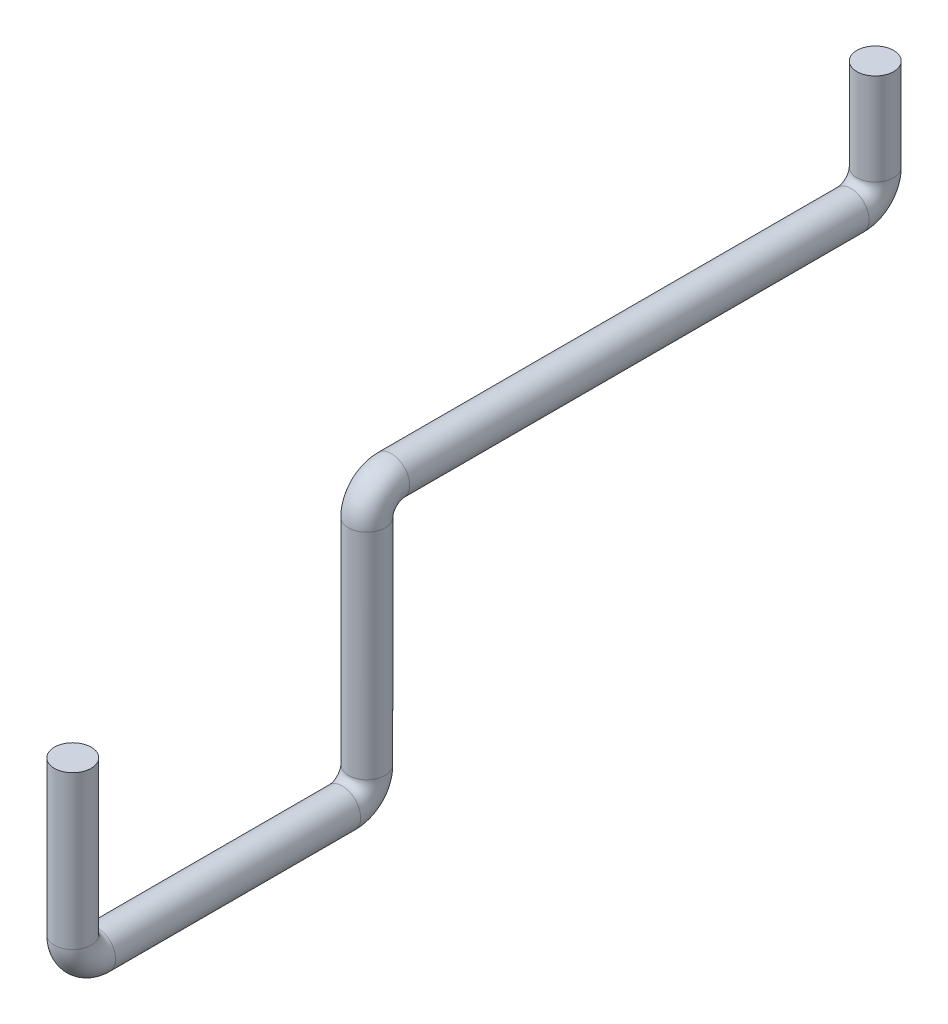
ISO-10303-21;
HEADER;
FILE_DESCRIPTION(('STEP AP214'),'2;1');
FILE_NAME('part.step','',(''),(''),'','','');
FILE_SCHEMA(('AUTOMOTIVE_DESIGN { 1 0 10303 214 1 1 1 1 }'));
ENDSEC;
DATA;
#1=APPLICATION_CONTEXT('core data for automotive mechanical design processes');
#2=APPLICATION_PROTOCOL_DEFINITION('international standard','automotive_design',2000,#1);
#3=PRODUCT_CONTEXT('',#1,'mechanical');
#4=PRODUCT('Part','Part','',(#3));
#5=PRODUCT_RELATED_PRODUCT_CATEGORY('part','',(#4));
#6=PRODUCT_DEFINITION_FORMATION('','',#4);
#7=PRODUCT_DEFINITION_CONTEXT('part definition',#1,'design');
#8=PRODUCT_DEFINITION('design','',#6,#7);
#9=PRODUCT_DEFINITION_SHAPE('','',#8);
#10=(LENGTH_UNIT() NAMED_UNIT(*) SI_UNIT(.MILLI.,.METRE.));
#11=(NAMED_UNIT(*) PLANE_ANGLE_UNIT() SI_UNIT($,.RADIAN.));
#12=(NAMED_UNIT(*) SI_UNIT($,.STERADIAN.) SOLID_ANGLE_UNIT());
#13=UNCERTAINTY_MEASURE_WITH_UNIT(LENGTH_MEASURE(1.E-05),#10,'distance_accuracy_value','');
#14=(GEOMETRIC_REPRESENTATION_CONTEXT(3) GLOBAL_UNCERTAINTY_ASSIGNED_CONTEXT((#13)) GLOBAL_UNIT_ASSIGNED_CONTEXT((#10,
#11,#12)) REPRESENTATION_CONTEXT('',''));
#15=CARTESIAN_POINT('',(0.,0.,0.));
#16=DIRECTION('',(0.,0.,1.));
#17=DIRECTION('',(1.,0.,0.));
#18=AXIS2_PLACEMENT_3D('',#15,#16,#17);
#19=CARTESIAN_POINT('',(0.,0.,0.));
#20=DIRECTION('',(0.,1.,0.));
#21=DIRECTION('',(0.,0.,1.));
#22=AXIS2_PLACEMENT_3D('',#19,#20,#21);
#23=PLANE('',#22);
#24=CARTESIAN_POINT('',(0.,0.,0.));
#25=DIRECTION('',(0.,1.,0.));
#26=DIRECTION('',(0.,0.,1.));
#27=AXIS2_PLACEMENT_3D('',#24,#25,#26);
#28=CIRCLE('',#27,0.6);
#29=CARTESIAN_POINT('',(0.,0.,0.6));
#30=VERTEX_POINT('',#29);
#31=EDGE_CURVE('E69',#30,#30,#28,.T.);
#32=ORIENTED_EDGE('',*,*,#31,.T.);
#33=EDGE_LOOP('',(#32));
#34=FACE_BOUND('',#33,.T.);
#35=ADVANCED_FACE('F57',(#34),#23,.T.);
#36=CARTESIAN_POINT('',(0.,6.6,-26.2));
#37=DIRECTION('',(0.,-1.,0.));
#38=DIRECTION('',(0.,0.,-1.));
#39=AXIS2_PLACEMENT_3D('',#36,#37,#38);
#40=PLANE('',#39);
#41=CARTESIAN_POINT('',(0.,6.6,-26.2));
#42=DIRECTION('',(0.,-1.,0.));
#43=DIRECTION('',(0.,0.,-1.));
#44=AXIS2_PLACEMENT_3D('',#41,#42,#43);
#45=CIRCLE('',#44,0.6);
#46=CARTESIAN_POINT('',(0.,6.6,-26.8));
#47=VERTEX_POINT('',#46);
#48=EDGE_CURVE('E14',#47,#47,#45,.T.);
#49=ORIENTED_EDGE('',*,*,#48,.F.);
#50=EDGE_LOOP('',(#49));
#51=FACE_BOUND('',#50,.T.);
#52=ADVANCED_FACE('F75',(#51),#40,.F.);
#53=CARTESIAN_POINT('',(0.,0.,0.));
#54=DIRECTION('',(0.,-1.,0.));
#55=DIRECTION('',(0.,0.,-1.));
#56=AXIS2_PLACEMENT_3D('',#53,#54,#55);
#57=CYLINDRICAL_SURFACE('',#56,0.6);
#58=CARTESIAN_POINT('',(0.,-5.,0.));
#59=DIRECTION('',(0.,1.,0.));
#60=DIRECTION('',(0.,0.,1.));
#61=AXIS2_PLACEMENT_3D('',#58,#59,#60);
#62=CIRCLE('',#61,0.6);
#63=CARTESIAN_POINT('',(0.,-5.,0.6));
#64=VERTEX_POINT('',#63);
#65=EDGE_CURVE('E125',#64,#64,#62,.T.);
#66=ORIENTED_EDGE('',*,*,#65,.T.);
#67=EDGE_LOOP('',(#66));
#68=FACE_BOUND('',#67,.T.);
#69=ORIENTED_EDGE('',*,*,#31,.F.);
#70=EDGE_LOOP('',(#69));
#71=FACE_BOUND('',#70,.T.);
#72=ADVANCED_FACE('F77',(#68,#71),#57,.T.);
#73=CARTESIAN_POINT('',(0.,-5.,-0.800000000000001));
#74=DIRECTION('',(1.,0.,0.));
#75=DIRECTION('',(0.,0.,-1.));
#76=AXIS2_PLACEMENT_3D('',#73,#74,#75);
#77=TOROIDAL_SURFACE('',#76,0.800000000000001,0.6);
#78=CARTESIAN_POINT('',(0.,-5.8,-0.8));
#79=DIRECTION('',(0.,0.,1.));
#80=DIRECTION('',(0.,-1.,0.));
#81=AXIS2_PLACEMENT_3D('',#78,#79,#80);
#82=CIRCLE('',#81,0.6);
#83=CARTESIAN_POINT('',(0.,-6.4,-0.8));
#84=VERTEX_POINT('',#83);
#85=EDGE_CURVE('E122',#84,#84,#82,.T.);
#86=CARTESIAN_POINT('',(0.,-5.,-0.800000000000001));
#87=DIRECTION('',(1.,0.,0.));
#88=DIRECTION('',(0.,0.,-1.));
#89=AXIS2_PLACEMENT_3D('',#86,#87,#88);
#90=CIRCLE('',#89,1.4);
#91=EDGE_CURVE('',#64,#84,#90,.T.);
#92=ORIENTED_EDGE('',*,*,#65,.F.);
#93=ORIENTED_EDGE('',*,*,#85,.T.);
#94=ORIENTED_EDGE('',*,*,#91,.T.);
#95=ORIENTED_EDGE('',*,*,#91,.F.);
#96=EDGE_LOOP('',(#92,#94,#93,#95));
#97=FACE_BOUND('',#96,.T.);
#98=ADVANCED_FACE('F82',(#97),#77,.T.);
#99=CARTESIAN_POINT('',(0.,-5.8,-0.800000000000001));
#100=DIRECTION('',(0.,0.,-1.));
#101=DIRECTION('',(0.,1.,0.));
#102=AXIS2_PLACEMENT_3D('',#99,#100,#101);
#103=CYLINDRICAL_SURFACE('',#102,0.6);
#104=CARTESIAN_POINT('',(0.,-5.8,-8.8));
#105=DIRECTION('',(0.,0.,1.));
#106=DIRECTION('',(0.,-1.,0.));
#107=AXIS2_PLACEMENT_3D('',#104,#105,#106);
#108=CIRCLE('',#107,0.6);
#109=CARTESIAN_POINT('',(0.,-6.4,-8.8));
#110=VERTEX_POINT('',#109);
#111=EDGE_CURVE('E127',#110,#110,#108,.T.);
#112=ORIENTED_EDGE('',*,*,#111,.T.);
#113=EDGE_LOOP('',(#112));
#114=FACE_BOUND('',#113,.T.);
#115=ORIENTED_EDGE('',*,*,#85,.F.);
#116=EDGE_LOOP('',(#115));
#117=FACE_BOUND('',#116,.T.);
#118=ADVANCED_FACE('F110',(#114,#117),#103,.T.);
#119=CARTESIAN_POINT('',(0.,-5.,-8.8));
#120=DIRECTION('',(1.,0.,0.));
#121=DIRECTION('',(0.,0.,-1.));
#122=AXIS2_PLACEMENT_3D('',#119,#120,#121);
#123=TOROIDAL_SURFACE('',#122,0.799999999999999,0.6);
#124=CARTESIAN_POINT('',(0.,-4.99999999999997,-9.59999999999999));
#125=DIRECTION('',(0.,-1.,0.));
#126=DIRECTION('',(0.,0.,-1.));
#127=AXIS2_PLACEMENT_3D('',#124,#125,#126);
#128=CIRCLE('',#127,0.6);
#129=CARTESIAN_POINT('',(0.,-4.99999999999995,-10.2));
#130=VERTEX_POINT('',#129);
#131=EDGE_CURVE('E133',#130,#130,#128,.T.);
#132=CARTESIAN_POINT('',(0.,-5.,-8.8));
#133=DIRECTION('',(1.,0.,0.));
#134=DIRECTION('',(0.,0.,-1.));
#135=AXIS2_PLACEMENT_3D('',#132,#133,#134);
#136=CIRCLE('',#135,1.4);
#137=EDGE_CURVE('',#110,#130,#136,.T.);
#138=ORIENTED_EDGE('',*,*,#111,.F.);
#139=ORIENTED_EDGE('',*,*,#131,.T.);
#140=ORIENTED_EDGE('',*,*,#137,.T.);
#141=ORIENTED_EDGE('',*,*,#137,.F.);
#142=EDGE_LOOP('',(#138,#140,#139,#141));
#143=FACE_BOUND('',#142,.T.);
#144=ADVANCED_FACE('F106',(#143),#123,.T.);
#145=CARTESIAN_POINT('',(0.,-4.99999999999997,-9.59999999999999));
#146=DIRECTION('',(0.,1.,0.));
#147=DIRECTION('',(0.,0.,1.));
#148=AXIS2_PLACEMENT_3D('',#145,#146,#147);
#149=CYLINDRICAL_SURFACE('',#148,0.6);
#150=CARTESIAN_POINT('',(0.,2.00000000000003,-9.59999999999999));
#151=DIRECTION('',(0.,-1.,0.));
#152=DIRECTION('',(0.,0.,-1.));
#153=AXIS2_PLACEMENT_3D('',#150,#151,#152);
#154=CIRCLE('',#153,0.6);
#155=CARTESIAN_POINT('',(0.,2.00000000000005,-8.99999999999999));
#156=VERTEX_POINT('',#155);
#157=EDGE_CURVE('E136',#156,#156,#154,.T.);
#158=ORIENTED_EDGE('',*,*,#157,.T.);
#159=EDGE_LOOP('',(#158));
#160=FACE_BOUND('',#159,.T.);
#161=ORIENTED_EDGE('',*,*,#131,.F.);
#162=EDGE_LOOP('',(#161));
#163=FACE_BOUND('',#162,.T.);
#164=ADVANCED_FACE('F102',(#160,#163),#149,.T.);
#165=CARTESIAN_POINT('',(0.,2.,-10.4));
#166=DIRECTION('',(-1.,0.,0.));
#167=DIRECTION('',(0.,0.,1.));
#168=AXIS2_PLACEMENT_3D('',#165,#166,#167);
#169=TOROIDAL_SURFACE('',#168,0.800000000000009,0.6);
#170=CARTESIAN_POINT('',(0.,2.8,-10.4));
#171=DIRECTION('',(0.,0.,1.));
#172=DIRECTION('',(0.,-1.,0.));
#173=AXIS2_PLACEMENT_3D('',#170,#171,#172);
#174=CIRCLE('',#173,0.6);
#175=CARTESIAN_POINT('',(0.,3.40000000000001,-10.4));
#176=VERTEX_POINT('',#175);
#177=EDGE_CURVE('E139',#176,#176,#174,.T.);
#178=CARTESIAN_POINT('',(0.,2.,-10.4));
#179=DIRECTION('',(-1.,0.,0.));
#180=DIRECTION('',(0.,0.,1.));
#181=AXIS2_PLACEMENT_3D('',#178,#179,#180);
#182=CIRCLE('',#181,1.40000000000001);
#183=EDGE_CURVE('',#156,#176,#182,.T.);
#184=ORIENTED_EDGE('',*,*,#157,.F.);
#185=ORIENTED_EDGE('',*,*,#177,.T.);
#186=ORIENTED_EDGE('',*,*,#183,.T.);
#187=ORIENTED_EDGE('',*,*,#183,.F.);
#188=EDGE_LOOP('',(#184,#186,#185,#187));
#189=FACE_BOUND('',#188,.T.);
#190=ADVANCED_FACE('F98',(#189),#169,.T.);
#191=CARTESIAN_POINT('',(0.,2.8,-10.4));
#192=DIRECTION('',(0.,0.,-1.));
#193=DIRECTION('',(0.,1.,0.));
#194=AXIS2_PLACEMENT_3D('',#191,#192,#193);
#195=CYLINDRICAL_SURFACE('',#194,0.6);
#196=CARTESIAN_POINT('',(0.,2.8,-25.4));
#197=DIRECTION('',(0.,0.,1.));
#198=DIRECTION('',(0.,-1.,0.));
#199=AXIS2_PLACEMENT_3D('',#196,#197,#198);
#200=CIRCLE('',#199,0.6);
#201=CARTESIAN_POINT('',(0.,2.2,-25.4));
#202=VERTEX_POINT('',#201);
#203=EDGE_CURVE('E142',#202,#202,#200,.T.);
#204=ORIENTED_EDGE('',*,*,#203,.T.);
#205=EDGE_LOOP('',(#204));
#206=FACE_BOUND('',#205,.T.);
#207=ORIENTED_EDGE('',*,*,#177,.F.);
#208=EDGE_LOOP('',(#207));
#209=FACE_BOUND('',#208,.T.);
#210=ADVANCED_FACE('F92',(#206,#209),#195,.T.);
#211=CARTESIAN_POINT('',(0.,3.6,-25.4));
#212=DIRECTION('',(1.,0.,0.));
#213=DIRECTION('',(0.,0.,-1.));
#214=AXIS2_PLACEMENT_3D('',#211,#212,#213);
#215=TOROIDAL_SURFACE('',#214,0.800000000000003,0.6);
#216=CARTESIAN_POINT('',(0.,3.60000000000003,-26.2));
#217=DIRECTION('',(0.,-1.,0.));
#218=DIRECTION('',(0.,0.,-1.));
#219=AXIS2_PLACEMENT_3D('',#216,#217,#218);
#220=CIRCLE('',#219,0.6);
#221=CARTESIAN_POINT('',(0.,3.60000000000005,-26.8));
#222=VERTEX_POINT('',#221);
#223=EDGE_CURVE('E64',#222,#222,#220,.T.);
#224=CARTESIAN_POINT('',(0.,3.6,-25.4));
#225=DIRECTION('',(1.,0.,0.));
#226=DIRECTION('',(0.,0.,-1.));
#227=AXIS2_PLACEMENT_3D('',#224,#225,#226);
#228=CIRCLE('',#227,1.4);
#229=EDGE_CURVE('',#202,#222,#228,.T.);
#230=ORIENTED_EDGE('',*,*,#203,.F.);
#231=ORIENTED_EDGE('',*,*,#223,.T.);
#232=ORIENTED_EDGE('',*,*,#229,.T.);
#233=ORIENTED_EDGE('',*,*,#229,.F.);
#234=EDGE_LOOP('',(#230,#232,#231,#233));
#235=FACE_BOUND('',#234,.T.);
#236=ADVANCED_FACE('F88',(#235),#215,.T.);
#237=CARTESIAN_POINT('',(0.,3.6,-26.2));
#238=DIRECTION('',(0.,1.,0.));
#239=DIRECTION('',(0.,0.,1.));
#240=AXIS2_PLACEMENT_3D('',#237,#238,#239);
#241=CYLINDRICAL_SURFACE('',#240,0.6);
#242=ORIENTED_EDGE('',*,*,#48,.T.);
#243=EDGE_LOOP('',(#242));
#244=FACE_BOUND('',#243,.T.);
#245=ORIENTED_EDGE('',*,*,#223,.F.);
#246=EDGE_LOOP('',(#245));
#247=FACE_BOUND('',#246,.T.);
#248=ADVANCED_FACE('F72',(#244,#247),#241,.T.);
#249=CLOSED_SHELL('',(#35,#52,#72,#98,#118,#144,#164,#190,#210,#236,#248));
#250=MANIFOLD_SOLID_BREP('B2',#249);
#251=ADVANCED_BREP_SHAPE_REPRESENTATION('',(#18,#250),#14);
#252=SHAPE_DEFINITION_REPRESENTATION(#9,#251);
ENDSEC;
END-ISO-10303-21;
